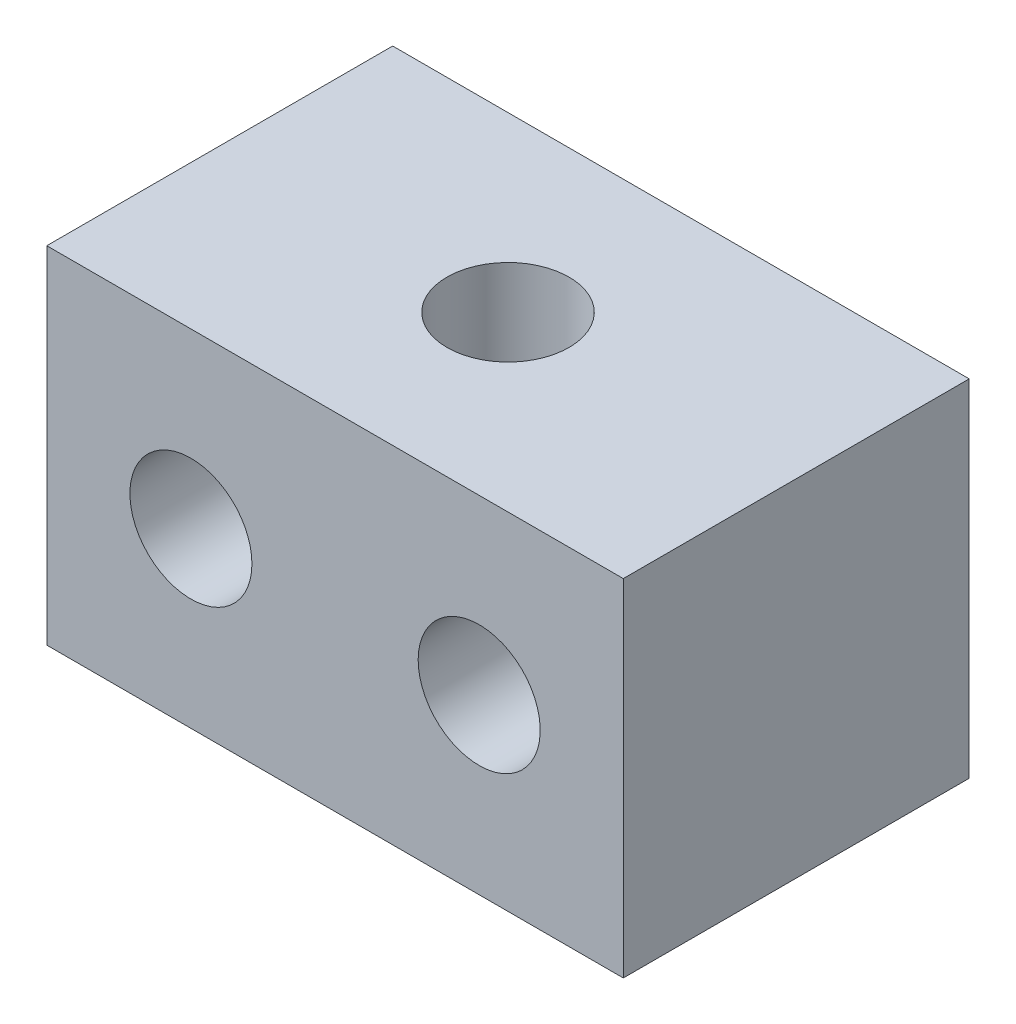
ISO-10303-21;
HEADER;
FILE_DESCRIPTION(('STEP AP214'),'2;1');
FILE_NAME('part.step','',(''),(''),'','','');
FILE_SCHEMA(('AUTOMOTIVE_DESIGN { 1 0 10303 214 1 1 1 1 }'));
ENDSEC;
DATA;
#1=APPLICATION_CONTEXT('core data for automotive mechanical design processes');
#2=APPLICATION_PROTOCOL_DEFINITION('international standard','automotive_design',2000,#1);
#3=PRODUCT_CONTEXT('',#1,'mechanical');
#4=PRODUCT('Part','Part','',(#3));
#5=PRODUCT_RELATED_PRODUCT_CATEGORY('part','',(#4));
#6=PRODUCT_DEFINITION_FORMATION('','',#4);
#7=PRODUCT_DEFINITION_CONTEXT('part definition',#1,'design');
#8=PRODUCT_DEFINITION('design','',#6,#7);
#9=PRODUCT_DEFINITION_SHAPE('','',#8);
#10=(LENGTH_UNIT() NAMED_UNIT(*) SI_UNIT(.MILLI.,.METRE.));
#11=(NAMED_UNIT(*) PLANE_ANGLE_UNIT() SI_UNIT($,.RADIAN.));
#12=(NAMED_UNIT(*) SI_UNIT($,.STERADIAN.) SOLID_ANGLE_UNIT());
#13=UNCERTAINTY_MEASURE_WITH_UNIT(LENGTH_MEASURE(1.E-05),#10,'distance_accuracy_value','');
#14=(GEOMETRIC_REPRESENTATION_CONTEXT(3) GLOBAL_UNCERTAINTY_ASSIGNED_CONTEXT((#13)) GLOBAL_UNIT_ASSIGNED_CONTEXT((#10,
#11,#12)) REPRESENTATION_CONTEXT('',''));
#15=CARTESIAN_POINT('',(0.,0.,0.));
#16=DIRECTION('',(0.,0.,1.));
#17=DIRECTION('',(1.,0.,0.));
#18=AXIS2_PLACEMENT_3D('',#15,#16,#17);
#19=CARTESIAN_POINT('',(7.5,9.,-4.5));
#20=DIRECTION('',(-1.,0.,0.));
#21=DIRECTION('',(0.,0.,1.));
#22=AXIS2_PLACEMENT_3D('',#19,#20,#21);
#23=PLANE('',#22);
#24=DIRECTION('',(0.,0.,-1.));
#25=VECTOR('',#24,1.);
#26=CARTESIAN_POINT('',(7.5,0.,-4.5));
#27=LINE('',#26,#25);
#28=CARTESIAN_POINT('',(7.5,0.,4.5));
#29=VERTEX_POINT('',#28);
#30=CARTESIAN_POINT('',(7.5,0.,-4.5));
#31=VERTEX_POINT('',#30);
#32=EDGE_CURVE('E96',#29,#31,#27,.T.);
#33=ORIENTED_EDGE('',*,*,#32,.T.);
#34=DIRECTION('',(0.,-1.,0.));
#35=VECTOR('',#34,1.);
#36=CARTESIAN_POINT('',(7.5,9.,-4.5));
#37=LINE('',#36,#35);
#38=CARTESIAN_POINT('',(7.5,9.,-4.5));
#39=VERTEX_POINT('',#38);
#40=EDGE_CURVE('E11',#39,#31,#37,.T.);
#41=ORIENTED_EDGE('',*,*,#40,.F.);
#42=DIRECTION('',(0.,0.,-1.));
#43=VECTOR('',#42,1.);
#44=CARTESIAN_POINT('',(7.5,9.,-4.5));
#45=LINE('',#44,#43);
#46=CARTESIAN_POINT('',(7.5,9.,4.5));
#47=VERTEX_POINT('',#46);
#48=EDGE_CURVE('E84',#47,#39,#45,.T.);
#49=ORIENTED_EDGE('',*,*,#48,.F.);
#50=DIRECTION('',(0.,-1.,0.));
#51=VECTOR('',#50,1.);
#52=CARTESIAN_POINT('',(7.5,9.,4.5));
#53=LINE('',#52,#51);
#54=EDGE_CURVE('E92',#47,#29,#53,.T.);
#55=ORIENTED_EDGE('',*,*,#54,.T.);
#56=EDGE_LOOP('',(#33,#41,#49,#55));
#57=FACE_BOUND('',#56,.T.);
#58=ADVANCED_FACE('F33',(#57),#23,.F.);
#59=CARTESIAN_POINT('',(-7.5,9.,-4.5));
#60=DIRECTION('',(0.,0.,1.));
#61=DIRECTION('',(1.,0.,0.));
#62=AXIS2_PLACEMENT_3D('',#59,#60,#61);
#63=PLANE('',#62);
#64=CARTESIAN_POINT('',(3.75,4.5,-4.5));
#65=DIRECTION('',(0.,0.,1.));
#66=DIRECTION('',(-1.,0.,0.));
#67=AXIS2_PLACEMENT_3D('',#64,#65,#66);
#68=CIRCLE('',#67,1.5875);
#69=CARTESIAN_POINT('',(2.1625,4.5,-4.5));
#70=VERTEX_POINT('',#69);
#71=EDGE_CURVE('E119',#70,#70,#68,.T.);
#72=ORIENTED_EDGE('',*,*,#71,.T.);
#73=EDGE_LOOP('',(#72));
#74=FACE_BOUND('',#73,.T.);
#75=CARTESIAN_POINT('',(-3.75,4.5,-4.5));
#76=DIRECTION('',(0.,0.,1.));
#77=DIRECTION('',(1.,0.,0.));
#78=AXIS2_PLACEMENT_3D('',#75,#76,#77);
#79=CIRCLE('',#78,1.5875);
#80=CARTESIAN_POINT('',(-2.1625,4.5,-4.5));
#81=VERTEX_POINT('',#80);
#82=EDGE_CURVE('E113',#81,#81,#79,.T.);
#83=ORIENTED_EDGE('',*,*,#82,.T.);
#84=EDGE_LOOP('',(#83));
#85=FACE_BOUND('',#84,.T.);
#86=DIRECTION('',(-1.,0.,0.));
#87=VECTOR('',#86,1.);
#88=CARTESIAN_POINT('',(-7.5,0.,-4.5));
#89=LINE('',#88,#87);
#90=CARTESIAN_POINT('',(-7.5,0.,-4.5));
#91=VERTEX_POINT('',#90);
#92=EDGE_CURVE('E88',#31,#91,#89,.T.);
#93=ORIENTED_EDGE('',*,*,#92,.T.);
#94=DIRECTION('',(0.,-1.,0.));
#95=VECTOR('',#94,1.);
#96=CARTESIAN_POINT('',(-7.5,9.,-4.5));
#97=LINE('',#96,#95);
#98=CARTESIAN_POINT('',(-7.5,9.,-4.5));
#99=VERTEX_POINT('',#98);
#100=EDGE_CURVE('E41',#99,#91,#97,.T.);
#101=ORIENTED_EDGE('',*,*,#100,.F.);
#102=DIRECTION('',(-1.,0.,0.));
#103=VECTOR('',#102,1.);
#104=CARTESIAN_POINT('',(-7.5,9.,-4.5));
#105=LINE('',#104,#103);
#106=EDGE_CURVE('E79',#39,#99,#105,.T.);
#107=ORIENTED_EDGE('',*,*,#106,.F.);
#108=ORIENTED_EDGE('',*,*,#40,.T.);
#109=EDGE_LOOP('',(#93,#101,#107,#108));
#110=FACE_BOUND('',#109,.T.);
#111=ADVANCED_FACE('F87',(#74,#85,#110),#63,.F.);
#112=CARTESIAN_POINT('',(-7.5,9.,-4.5));
#113=DIRECTION('',(1.,0.,0.));
#114=DIRECTION('',(0.,0.,-1.));
#115=AXIS2_PLACEMENT_3D('',#112,#113,#114);
#116=PLANE('',#115);
#117=DIRECTION('',(0.,0.,1.));
#118=VECTOR('',#117,1.);
#119=CARTESIAN_POINT('',(-7.5,0.,-4.5));
#120=LINE('',#119,#118);
#121=CARTESIAN_POINT('',(-7.5,0.,4.5));
#122=VERTEX_POINT('',#121);
#123=EDGE_CURVE('E66',#91,#122,#120,.T.);
#124=ORIENTED_EDGE('',*,*,#123,.T.);
#125=DIRECTION('',(0.,-1.,0.));
#126=VECTOR('',#125,1.);
#127=CARTESIAN_POINT('',(-7.5,9.,4.5));
#128=LINE('',#127,#126);
#129=CARTESIAN_POINT('',(-7.5,9.,4.5));
#130=VERTEX_POINT('',#129);
#131=EDGE_CURVE('E89',#130,#122,#128,.T.);
#132=ORIENTED_EDGE('',*,*,#131,.F.);
#133=DIRECTION('',(0.,0.,1.));
#134=VECTOR('',#133,1.);
#135=CARTESIAN_POINT('',(-7.5,9.,-4.5));
#136=LINE('',#135,#134);
#137=EDGE_CURVE('E82',#99,#130,#136,.T.);
#138=ORIENTED_EDGE('',*,*,#137,.F.);
#139=ORIENTED_EDGE('',*,*,#100,.T.);
#140=EDGE_LOOP('',(#124,#132,#138,#139));
#141=FACE_BOUND('',#140,.T.);
#142=ADVANCED_FACE('F90',(#141),#116,.F.);
#143=CARTESIAN_POINT('',(-7.5,9.,4.5));
#144=DIRECTION('',(0.,0.,-1.));
#145=DIRECTION('',(-1.,0.,0.));
#146=AXIS2_PLACEMENT_3D('',#143,#144,#145);
#147=PLANE('',#146);
#148=CARTESIAN_POINT('',(3.75,4.5,4.5));
#149=DIRECTION('',(0.,0.,1.));
#150=DIRECTION('',(-1.,0.,0.));
#151=AXIS2_PLACEMENT_3D('',#148,#149,#150);
#152=CIRCLE('',#151,1.5875);
#153=CARTESIAN_POINT('',(2.1625,4.5,4.5));
#154=VERTEX_POINT('',#153);
#155=EDGE_CURVE('E122',#154,#154,#152,.T.);
#156=ORIENTED_EDGE('',*,*,#155,.F.);
#157=EDGE_LOOP('',(#156));
#158=FACE_BOUND('',#157,.T.);
#159=CARTESIAN_POINT('',(-3.75,4.5,4.5));
#160=DIRECTION('',(0.,0.,1.));
#161=DIRECTION('',(1.,0.,0.));
#162=AXIS2_PLACEMENT_3D('',#159,#160,#161);
#163=CIRCLE('',#162,1.5875);
#164=CARTESIAN_POINT('',(-2.1625,4.5,4.5));
#165=VERTEX_POINT('',#164);
#166=EDGE_CURVE('E116',#165,#165,#163,.T.);
#167=ORIENTED_EDGE('',*,*,#166,.F.);
#168=EDGE_LOOP('',(#167));
#169=FACE_BOUND('',#168,.T.);
#170=DIRECTION('',(1.,0.,0.));
#171=VECTOR('',#170,1.);
#172=CARTESIAN_POINT('',(-7.5,0.,4.5));
#173=LINE('',#172,#171);
#174=EDGE_CURVE('E72',#122,#29,#173,.T.);
#175=ORIENTED_EDGE('',*,*,#174,.T.);
#176=ORIENTED_EDGE('',*,*,#54,.F.);
#177=DIRECTION('',(1.,0.,0.));
#178=VECTOR('',#177,1.);
#179=CARTESIAN_POINT('',(-7.5,9.,4.5));
#180=LINE('',#179,#178);
#181=EDGE_CURVE('E49',#130,#47,#180,.T.);
#182=ORIENTED_EDGE('',*,*,#181,.F.);
#183=ORIENTED_EDGE('',*,*,#131,.T.);
#184=EDGE_LOOP('',(#175,#176,#182,#183));
#185=FACE_BOUND('',#184,.T.);
#186=ADVANCED_FACE('F104',(#158,#169,#185),#147,.F.);
#187=CARTESIAN_POINT('',(0.,9.,0.));
#188=DIRECTION('',(0.,1.,0.));
#189=DIRECTION('',(0.,0.,1.));
#190=AXIS2_PLACEMENT_3D('',#187,#188,#189);
#191=PLANE('',#190);
#192=CARTESIAN_POINT('',(0.,9.,0.));
#193=DIRECTION('',(0.,1.,0.));
#194=DIRECTION('',(0.,0.,1.));
#195=AXIS2_PLACEMENT_3D('',#192,#193,#194);
#196=CIRCLE('',#195,1.5875);
#197=CARTESIAN_POINT('',(0.,9.,1.5875));
#198=VERTEX_POINT('',#197);
#199=EDGE_CURVE('E110',#198,#198,#196,.T.);
#200=ORIENTED_EDGE('',*,*,#199,.F.);
#201=EDGE_LOOP('',(#200));
#202=FACE_BOUND('',#201,.T.);
#203=ORIENTED_EDGE('',*,*,#48,.T.);
#204=ORIENTED_EDGE('',*,*,#106,.T.);
#205=ORIENTED_EDGE('',*,*,#137,.T.);
#206=ORIENTED_EDGE('',*,*,#181,.T.);
#207=EDGE_LOOP('',(#203,#204,#205,#206));
#208=FACE_BOUND('',#207,.T.);
#209=ADVANCED_FACE('F80',(#202,#208),#191,.T.);
#210=CARTESIAN_POINT('',(0.,0.,0.));
#211=DIRECTION('',(0.,1.,0.));
#212=DIRECTION('',(0.,0.,1.));
#213=AXIS2_PLACEMENT_3D('',#210,#211,#212);
#214=PLANE('',#213);
#215=CARTESIAN_POINT('',(0.,0.,0.));
#216=DIRECTION('',(0.,1.,0.));
#217=DIRECTION('',(0.,0.,1.));
#218=AXIS2_PLACEMENT_3D('',#215,#216,#217);
#219=CIRCLE('',#218,1.5875);
#220=CARTESIAN_POINT('',(0.,0.,1.5875));
#221=VERTEX_POINT('',#220);
#222=EDGE_CURVE('E99',#221,#221,#219,.T.);
#223=ORIENTED_EDGE('',*,*,#222,.T.);
#224=EDGE_LOOP('',(#223));
#225=FACE_BOUND('',#224,.T.);
#226=ORIENTED_EDGE('',*,*,#32,.F.);
#227=ORIENTED_EDGE('',*,*,#174,.F.);
#228=ORIENTED_EDGE('',*,*,#123,.F.);
#229=ORIENTED_EDGE('',*,*,#92,.F.);
#230=EDGE_LOOP('',(#226,#227,#228,#229));
#231=FACE_BOUND('',#230,.T.);
#232=ADVANCED_FACE('F107',(#225,#231),#214,.F.);
#233=CARTESIAN_POINT('',(0.,0.,0.));
#234=DIRECTION('',(0.,1.,0.));
#235=DIRECTION('',(0.,0.,1.));
#236=AXIS2_PLACEMENT_3D('',#233,#234,#235);
#237=CYLINDRICAL_SURFACE('',#236,1.5875);
#238=ORIENTED_EDGE('',*,*,#222,.F.);
#239=EDGE_LOOP('',(#238));
#240=FACE_BOUND('',#239,.T.);
#241=ORIENTED_EDGE('',*,*,#199,.T.);
#242=EDGE_LOOP('',(#241));
#243=FACE_BOUND('',#242,.T.);
#244=ADVANCED_FACE('F143',(#240,#243),#237,.F.);
#245=CARTESIAN_POINT('',(-3.75,4.5,-4.5));
#246=DIRECTION('',(0.,0.,1.));
#247=DIRECTION('',(1.,0.,0.));
#248=AXIS2_PLACEMENT_3D('',#245,#246,#247);
#249=CYLINDRICAL_SURFACE('',#248,1.5875);
#250=ORIENTED_EDGE('',*,*,#82,.F.);
#251=EDGE_LOOP('',(#250));
#252=FACE_BOUND('',#251,.T.);
#253=ORIENTED_EDGE('',*,*,#166,.T.);
#254=EDGE_LOOP('',(#253));
#255=FACE_BOUND('',#254,.T.);
#256=ADVANCED_FACE('F133',(#252,#255),#249,.F.);
#257=CARTESIAN_POINT('',(3.75,4.5,-4.5));
#258=DIRECTION('',(0.,0.,1.));
#259=DIRECTION('',(1.,0.,0.));
#260=AXIS2_PLACEMENT_3D('',#257,#258,#259);
#261=CYLINDRICAL_SURFACE('',#260,1.5875);
#262=ORIENTED_EDGE('',*,*,#71,.F.);
#263=EDGE_LOOP('',(#262));
#264=FACE_BOUND('',#263,.T.);
#265=ORIENTED_EDGE('',*,*,#155,.T.);
#266=EDGE_LOOP('',(#265));
#267=FACE_BOUND('',#266,.T.);
#268=ADVANCED_FACE('F130',(#264,#267),#261,.F.);
#269=CLOSED_SHELL('',(#58,#111,#142,#186,#209,#232,#244,#256,#268));
#270=MANIFOLD_SOLID_BREP('B2',#269);
#271=ADVANCED_BREP_SHAPE_REPRESENTATION('',(#18,#270),#14);
#272=SHAPE_DEFINITION_REPRESENTATION(#9,#271);
ENDSEC;
END-ISO-10303-21;
